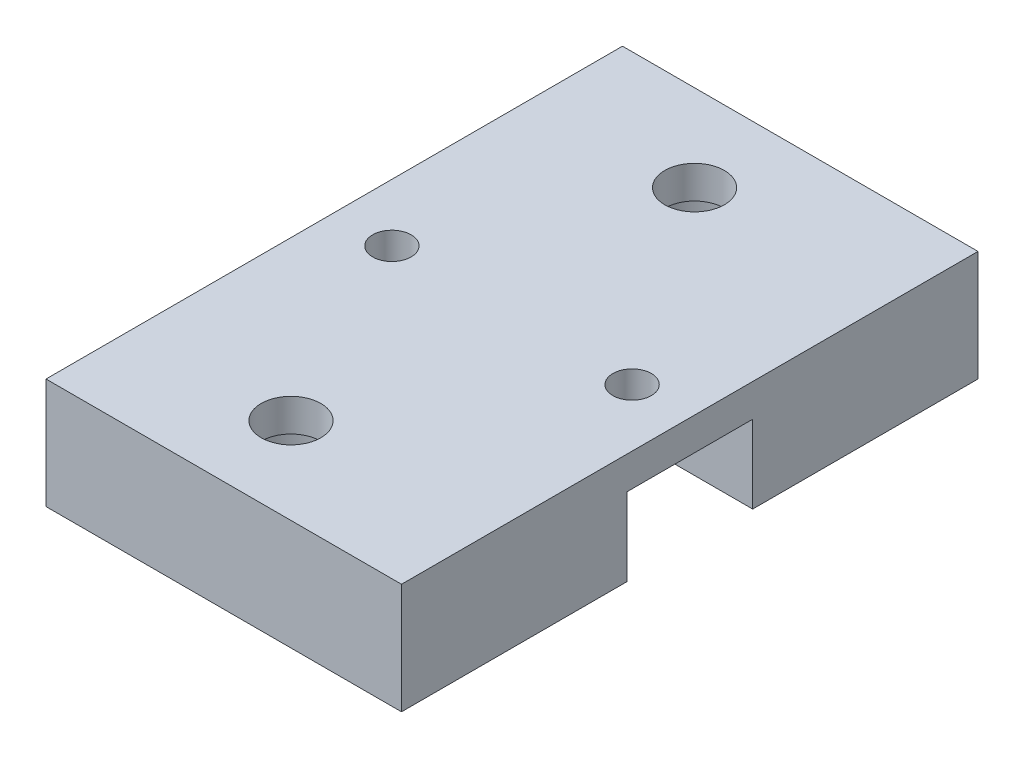
ISO-10303-21;
HEADER;
FILE_DESCRIPTION(('STEP AP214'),'2;1');
FILE_NAME('part.step','',(''),(''),'','','');
FILE_SCHEMA(('AUTOMOTIVE_DESIGN { 1 0 10303 214 1 1 1 1 }'));
ENDSEC;
DATA;
#1=APPLICATION_CONTEXT('core data for automotive mechanical design processes');
#2=APPLICATION_PROTOCOL_DEFINITION('international standard','automotive_design',2000,#1);
#3=PRODUCT_CONTEXT('',#1,'mechanical');
#4=PRODUCT('Part','Part','',(#3));
#5=PRODUCT_RELATED_PRODUCT_CATEGORY('part','',(#4));
#6=PRODUCT_DEFINITION_FORMATION('','',#4);
#7=PRODUCT_DEFINITION_CONTEXT('part definition',#1,'design');
#8=PRODUCT_DEFINITION('design','',#6,#7);
#9=PRODUCT_DEFINITION_SHAPE('','',#8);
#10=(LENGTH_UNIT() NAMED_UNIT(*) SI_UNIT(.MILLI.,.METRE.));
#11=(NAMED_UNIT(*) PLANE_ANGLE_UNIT() SI_UNIT($,.RADIAN.));
#12=(NAMED_UNIT(*) SI_UNIT($,.STERADIAN.) SOLID_ANGLE_UNIT());
#13=UNCERTAINTY_MEASURE_WITH_UNIT(LENGTH_MEASURE(1.E-05),#10,'distance_accuracy_value','');
#14=(GEOMETRIC_REPRESENTATION_CONTEXT(3) GLOBAL_UNCERTAINTY_ASSIGNED_CONTEXT((#13)) GLOBAL_UNIT_ASSIGNED_CONTEXT((#10,
#11,#12)) REPRESENTATION_CONTEXT('',''));
#15=CARTESIAN_POINT('',(0.,0.,0.));
#16=DIRECTION('',(0.,0.,1.));
#17=DIRECTION('',(1.,0.,0.));
#18=AXIS2_PLACEMENT_3D('',#15,#16,#17);
#19=CARTESIAN_POINT('',(0.,0.,0.));
#20=DIRECTION('',(0.,1.,0.));
#21=DIRECTION('',(0.,0.,1.));
#22=AXIS2_PLACEMENT_3D('',#19,#20,#21);
#23=PLANE('',#22);
#24=CARTESIAN_POINT('',(41.5,0.,-21.));
#25=DIRECTION('',(0.,1.,0.));
#26=DIRECTION('',(0.,0.,1.));
#27=AXIS2_PLACEMENT_3D('',#24,#25,#26);
#28=CIRCLE('',#27,3.09999999999999);
#29=CARTESIAN_POINT('',(41.5,0.,-17.9));
#30=VERTEX_POINT('',#29);
#31=EDGE_CURVE('E185',#30,#30,#28,.T.);
#32=ORIENTED_EDGE('',*,*,#31,.T.);
#33=EDGE_LOOP('',(#32));
#34=FACE_BOUND('',#33,.T.);
#35=CARTESIAN_POINT('',(41.5,0.,-21.));
#36=DIRECTION('',(0.,-1.,0.));
#37=DIRECTION('',(0.,0.,1.));
#38=AXIS2_PLACEMENT_3D('',#35,#36,#37);
#39=CIRCLE('',#38,5.5);
#40=CARTESIAN_POINT('',(41.5,0.,-15.5));
#41=VERTEX_POINT('',#40);
#42=EDGE_CURVE('E134',#41,#41,#39,.T.);
#43=ORIENTED_EDGE('',*,*,#42,.T.);
#44=EDGE_LOOP('',(#43));
#45=FACE_BOUND('',#44,.T.);
#46=ADVANCED_FACE('F41',(#34,#45),#23,.F.);
#47=CARTESIAN_POINT('',(41.5,0.,21.));
#48=DIRECTION('',(0.,1.,0.));
#49=DIRECTION('',(0.,0.,-1.));
#50=AXIS2_PLACEMENT_3D('',#47,#48,#49);
#51=CIRCLE('',#50,3.09999999999999);
#52=CARTESIAN_POINT('',(41.5,0.,17.9));
#53=VERTEX_POINT('',#52);
#54=EDGE_CURVE('E179',#53,#53,#51,.T.);
#55=ORIENTED_EDGE('',*,*,#54,.T.);
#56=EDGE_LOOP('',(#55));
#57=FACE_BOUND('',#56,.T.);
#58=CARTESIAN_POINT('',(41.5,0.,21.));
#59=DIRECTION('',(0.,-1.,0.));
#60=DIRECTION('',(0.,0.,-1.));
#61=AXIS2_PLACEMENT_3D('',#58,#59,#60);
#62=CIRCLE('',#61,5.5);
#63=CARTESIAN_POINT('',(41.5,0.,15.5));
#64=VERTEX_POINT('',#63);
#65=EDGE_CURVE('E143',#64,#64,#62,.T.);
#66=ORIENTED_EDGE('',*,*,#65,.T.);
#67=EDGE_LOOP('',(#66));
#68=FACE_BOUND('',#67,.T.);
#69=ADVANCED_FACE('F238',(#57,#68),#23,.F.);
#70=CARTESIAN_POINT('',(0.,3.4,0.));
#71=DIRECTION('',(0.,1.,0.));
#72=DIRECTION('',(0.,0.,1.));
#73=AXIS2_PLACEMENT_3D('',#70,#71,#72);
#74=PLANE('',#73);
#75=CARTESIAN_POINT('',(56.,3.4,0.));
#76=DIRECTION('',(0.,1.,0.));
#77=DIRECTION('',(0.,0.,1.));
#78=AXIS2_PLACEMENT_3D('',#75,#76,#77);
#79=CIRCLE('',#78,2.);
#80=CARTESIAN_POINT('',(56.,3.4,2.));
#81=VERTEX_POINT('',#80);
#82=EDGE_CURVE('E176',#81,#81,#79,.T.);
#83=ORIENTED_EDGE('',*,*,#82,.F.);
#84=EDGE_LOOP('',(#83));
#85=FACE_BOUND('',#84,.T.);
#86=CARTESIAN_POINT('',(41.5,3.4,-21.));
#87=DIRECTION('',(0.,1.,0.));
#88=DIRECTION('',(0.,0.,1.));
#89=AXIS2_PLACEMENT_3D('',#86,#87,#88);
#90=CIRCLE('',#89,3.09999999999999);
#91=CARTESIAN_POINT('',(41.5,3.4,-17.9));
#92=VERTEX_POINT('',#91);
#93=EDGE_CURVE('E188',#92,#92,#90,.T.);
#94=ORIENTED_EDGE('',*,*,#93,.F.);
#95=EDGE_LOOP('',(#94));
#96=FACE_BOUND('',#95,.T.);
#97=DIRECTION('',(0.,0.,1.));
#98=VECTOR('',#97,1.);
#99=CARTESIAN_POINT('',(25.,3.4,-30.));
#100=LINE('',#99,#98);
#101=CARTESIAN_POINT('',(25.,3.4,-30.));
#102=VERTEX_POINT('',#101);
#103=CARTESIAN_POINT('',(25.,3.4,30.));
#104=VERTEX_POINT('',#103);
#105=EDGE_CURVE('E112',#102,#104,#100,.T.);
#106=ORIENTED_EDGE('',*,*,#105,.T.);
#107=DIRECTION('',(1.,0.,0.));
#108=VECTOR('',#107,1.);
#109=CARTESIAN_POINT('',(25.,3.4,30.));
#110=LINE('',#109,#108);
#111=CARTESIAN_POINT('',(62.,3.4,30.));
#112=VERTEX_POINT('',#111);
#113=EDGE_CURVE('E194',#104,#112,#110,.T.);
#114=ORIENTED_EDGE('',*,*,#113,.T.);
#115=DIRECTION('',(0.,0.,-1.));
#116=VECTOR('',#115,1.);
#117=CARTESIAN_POINT('',(62.,3.4,-30.));
#118=LINE('',#117,#116);
#119=CARTESIAN_POINT('',(62.,3.4,-30.));
#120=VERTEX_POINT('',#119);
#121=EDGE_CURVE('E197',#112,#120,#118,.T.);
#122=ORIENTED_EDGE('',*,*,#121,.T.);
#123=DIRECTION('',(-1.,0.,0.));
#124=VECTOR('',#123,1.);
#125=CARTESIAN_POINT('',(25.,3.4,-30.));
#126=LINE('',#125,#124);
#127=EDGE_CURVE('E64',#120,#102,#126,.T.);
#128=ORIENTED_EDGE('',*,*,#127,.T.);
#129=EDGE_LOOP('',(#106,#114,#122,#128));
#130=FACE_BOUND('',#129,.T.);
#131=CARTESIAN_POINT('',(41.5,3.4,21.));
#132=DIRECTION('',(0.,1.,0.));
#133=DIRECTION('',(0.,0.,-1.));
#134=AXIS2_PLACEMENT_3D('',#131,#132,#133);
#135=CIRCLE('',#134,3.09999999999999);
#136=CARTESIAN_POINT('',(41.5,3.4,17.9));
#137=VERTEX_POINT('',#136);
#138=EDGE_CURVE('E182',#137,#137,#135,.T.);
#139=ORIENTED_EDGE('',*,*,#138,.F.);
#140=EDGE_LOOP('',(#139));
#141=FACE_BOUND('',#140,.T.);
#142=CARTESIAN_POINT('',(31.,3.4,1.74574066942157E-13));
#143=DIRECTION('',(0.,1.,0.));
#144=DIRECTION('',(0.,0.,1.));
#145=AXIS2_PLACEMENT_3D('',#142,#143,#144);
#146=CIRCLE('',#145,2.);
#147=CARTESIAN_POINT('',(31.,3.4,2.00000000000018));
#148=VERTEX_POINT('',#147);
#149=EDGE_CURVE('E170',#148,#148,#146,.T.);
#150=ORIENTED_EDGE('',*,*,#149,.F.);
#151=EDGE_LOOP('',(#150));
#152=FACE_BOUND('',#151,.T.);
#153=ADVANCED_FACE('F245',(#85,#96,#130,#141,#152),#74,.T.);
#154=DIRECTION('',(-1.,0.,0.));
#155=VECTOR('',#154,1.);
#156=CARTESIAN_POINT('',(25.,0.,-6.55));
#157=LINE('',#156,#155);
#158=CARTESIAN_POINT('',(62.,0.,-6.55));
#159=VERTEX_POINT('',#158);
#160=CARTESIAN_POINT('',(25.,0.,-6.55));
#161=VERTEX_POINT('',#160);
#162=EDGE_CURVE('E129',#159,#161,#157,.T.);
#163=ORIENTED_EDGE('',*,*,#162,.F.);
#164=DIRECTION('',(0.,0.,-1.));
#165=VECTOR('',#164,1.);
#166=CARTESIAN_POINT('',(62.,0.,-30.));
#167=LINE('',#166,#165);
#168=CARTESIAN_POINT('',(62.,0.,6.55));
#169=VERTEX_POINT('',#168);
#170=EDGE_CURVE('E195',#169,#159,#167,.T.);
#171=ORIENTED_EDGE('',*,*,#170,.F.);
#172=DIRECTION('',(1.,0.,0.));
#173=VECTOR('',#172,1.);
#174=CARTESIAN_POINT('',(25.,0.,6.55));
#175=LINE('',#174,#173);
#176=CARTESIAN_POINT('',(25.,0.,6.55));
#177=VERTEX_POINT('',#176);
#178=EDGE_CURVE('E147',#177,#169,#175,.T.);
#179=ORIENTED_EDGE('',*,*,#178,.F.);
#180=DIRECTION('',(0.,0.,1.));
#181=VECTOR('',#180,1.);
#182=CARTESIAN_POINT('',(25.,0.,-30.));
#183=LINE('',#182,#181);
#184=EDGE_CURVE('E56',#161,#177,#183,.T.);
#185=ORIENTED_EDGE('',*,*,#184,.F.);
#186=EDGE_LOOP('',(#163,#171,#179,#185));
#187=FACE_BOUND('',#186,.T.);
#188=CARTESIAN_POINT('',(56.,0.,0.));
#189=DIRECTION('',(0.,1.,0.));
#190=DIRECTION('',(0.,0.,1.));
#191=AXIS2_PLACEMENT_3D('',#188,#189,#190);
#192=CIRCLE('',#191,2.);
#193=CARTESIAN_POINT('',(56.,0.,2.));
#194=VERTEX_POINT('',#193);
#195=EDGE_CURVE('E173',#194,#194,#192,.T.);
#196=ORIENTED_EDGE('',*,*,#195,.T.);
#197=EDGE_LOOP('',(#196));
#198=FACE_BOUND('',#197,.T.);
#199=CARTESIAN_POINT('',(31.,0.,1.74574066942157E-13));
#200=DIRECTION('',(0.,1.,0.));
#201=DIRECTION('',(0.,0.,1.));
#202=AXIS2_PLACEMENT_3D('',#199,#200,#201);
#203=CIRCLE('',#202,2.);
#204=CARTESIAN_POINT('',(31.,0.,2.00000000000018));
#205=VERTEX_POINT('',#204);
#206=EDGE_CURVE('E169',#205,#205,#203,.T.);
#207=ORIENTED_EDGE('',*,*,#206,.T.);
#208=EDGE_LOOP('',(#207));
#209=FACE_BOUND('',#208,.T.);
#210=ADVANCED_FACE('F221',(#187,#198,#209),#23,.F.);
#211=CARTESIAN_POINT('',(25.,3.4,-30.));
#212=DIRECTION('',(1.,0.,0.));
#213=DIRECTION('',(0.,0.,-1.));
#214=AXIS2_PLACEMENT_3D('',#211,#212,#213);
#215=PLANE('',#214);
#216=DIRECTION('',(0.,-1.,0.));
#217=VECTOR('',#216,1.);
#218=CARTESIAN_POINT('',(25.,3.4,-30.));
#219=LINE('',#218,#217);
#220=CARTESIAN_POINT('',(25.,-8.1,-30.));
#221=VERTEX_POINT('',#220);
#222=EDGE_CURVE('E107',#102,#221,#219,.T.);
#223=ORIENTED_EDGE('',*,*,#222,.T.);
#224=DIRECTION('',(0.,0.,-1.));
#225=VECTOR('',#224,1.);
#226=CARTESIAN_POINT('',(25.,-8.1,-30.));
#227=LINE('',#226,#225);
#228=CARTESIAN_POINT('',(25.,-8.1,-6.55));
#229=VERTEX_POINT('',#228);
#230=EDGE_CURVE('E110',#229,#221,#227,.T.);
#231=ORIENTED_EDGE('',*,*,#230,.F.);
#232=DIRECTION('',(0.,1.,0.));
#233=VECTOR('',#232,1.);
#234=CARTESIAN_POINT('',(25.,-8.1,-6.55));
#235=LINE('',#234,#233);
#236=EDGE_CURVE('E138',#229,#161,#235,.T.);
#237=ORIENTED_EDGE('',*,*,#236,.T.);
#238=ORIENTED_EDGE('',*,*,#184,.T.);
#239=DIRECTION('',(0.,1.,0.));
#240=VECTOR('',#239,1.);
#241=CARTESIAN_POINT('',(25.,-8.1,6.55));
#242=LINE('',#241,#240);
#243=CARTESIAN_POINT('',(25.,-8.1,6.55));
#244=VERTEX_POINT('',#243);
#245=EDGE_CURVE('E166',#244,#177,#242,.T.);
#246=ORIENTED_EDGE('',*,*,#245,.F.);
#247=DIRECTION('',(0.,0.,-1.));
#248=VECTOR('',#247,1.);
#249=CARTESIAN_POINT('',(25.,-8.1,30.));
#250=LINE('',#249,#248);
#251=CARTESIAN_POINT('',(25.,-8.1,30.));
#252=VERTEX_POINT('',#251);
#253=EDGE_CURVE('E150',#252,#244,#250,.T.);
#254=ORIENTED_EDGE('',*,*,#253,.F.);
#255=DIRECTION('',(0.,-1.,0.));
#256=VECTOR('',#255,1.);
#257=CARTESIAN_POINT('',(25.,3.4,30.));
#258=LINE('',#257,#256);
#259=EDGE_CURVE('E11',#104,#252,#258,.T.);
#260=ORIENTED_EDGE('',*,*,#259,.F.);
#261=ORIENTED_EDGE('',*,*,#105,.F.);
#262=EDGE_LOOP('',(#223,#231,#237,#238,#246,#254,#260,#261));
#263=FACE_BOUND('',#262,.T.);
#264=ADVANCED_FACE('F43',(#263),#215,.F.);
#265=CARTESIAN_POINT('',(25.,3.4,30.));
#266=DIRECTION('',(0.,0.,-1.));
#267=DIRECTION('',(-1.,0.,0.));
#268=AXIS2_PLACEMENT_3D('',#265,#266,#267);
#269=PLANE('',#268);
#270=ORIENTED_EDGE('',*,*,#259,.T.);
#271=DIRECTION('',(-1.,0.,0.));
#272=VECTOR('',#271,1.);
#273=CARTESIAN_POINT('',(25.,-8.1,30.));
#274=LINE('',#273,#272);
#275=CARTESIAN_POINT('',(62.,-8.1,30.));
#276=VERTEX_POINT('',#275);
#277=EDGE_CURVE('E158',#276,#252,#274,.T.);
#278=ORIENTED_EDGE('',*,*,#277,.F.);
#279=DIRECTION('',(0.,-1.,0.));
#280=VECTOR('',#279,1.);
#281=CARTESIAN_POINT('',(62.,3.4,30.));
#282=LINE('',#281,#280);
#283=EDGE_CURVE('E49',#112,#276,#282,.T.);
#284=ORIENTED_EDGE('',*,*,#283,.F.);
#285=ORIENTED_EDGE('',*,*,#113,.F.);
#286=EDGE_LOOP('',(#270,#278,#284,#285));
#287=FACE_BOUND('',#286,.T.);
#288=ADVANCED_FACE('F215',(#287),#269,.F.);
#289=CARTESIAN_POINT('',(62.,3.4,-30.));
#290=DIRECTION('',(-1.,0.,0.));
#291=DIRECTION('',(0.,0.,1.));
#292=AXIS2_PLACEMENT_3D('',#289,#290,#291);
#293=PLANE('',#292);
#294=ORIENTED_EDGE('',*,*,#283,.T.);
#295=DIRECTION('',(0.,0.,1.));
#296=VECTOR('',#295,1.);
#297=CARTESIAN_POINT('',(62.,-8.1,30.));
#298=LINE('',#297,#296);
#299=CARTESIAN_POINT('',(62.,-8.1,6.55));
#300=VERTEX_POINT('',#299);
#301=EDGE_CURVE('E155',#300,#276,#298,.T.);
#302=ORIENTED_EDGE('',*,*,#301,.F.);
#303=DIRECTION('',(0.,1.,0.));
#304=VECTOR('',#303,1.);
#305=CARTESIAN_POINT('',(62.,-8.1,6.55));
#306=LINE('',#305,#304);
#307=EDGE_CURVE('E161',#300,#169,#306,.T.);
#308=ORIENTED_EDGE('',*,*,#307,.T.);
#309=ORIENTED_EDGE('',*,*,#170,.T.);
#310=DIRECTION('',(0.,1.,0.));
#311=VECTOR('',#310,1.);
#312=CARTESIAN_POINT('',(62.,-8.1,-6.55));
#313=LINE('',#312,#311);
#314=CARTESIAN_POINT('',(62.,-8.1,-6.55));
#315=VERTEX_POINT('',#314);
#316=EDGE_CURVE('E141',#315,#159,#313,.T.);
#317=ORIENTED_EDGE('',*,*,#316,.F.);
#318=DIRECTION('',(0.,0.,1.));
#319=VECTOR('',#318,1.);
#320=CARTESIAN_POINT('',(62.,-8.1,-30.));
#321=LINE('',#320,#319);
#322=CARTESIAN_POINT('',(62.,-8.1,-30.));
#323=VERTEX_POINT('',#322);
#324=EDGE_CURVE('E122',#323,#315,#321,.T.);
#325=ORIENTED_EDGE('',*,*,#324,.F.);
#326=DIRECTION('',(0.,-1.,0.));
#327=VECTOR('',#326,1.);
#328=CARTESIAN_POINT('',(62.,3.4,-30.));
#329=LINE('',#328,#327);
#330=EDGE_CURVE('E114',#120,#323,#329,.T.);
#331=ORIENTED_EDGE('',*,*,#330,.F.);
#332=ORIENTED_EDGE('',*,*,#121,.F.);
#333=EDGE_LOOP('',(#294,#302,#308,#309,#317,#325,#331,#332));
#334=FACE_BOUND('',#333,.T.);
#335=ADVANCED_FACE('F207',(#334),#293,.F.);
#336=CARTESIAN_POINT('',(25.,3.4,-30.));
#337=DIRECTION('',(0.,0.,1.));
#338=DIRECTION('',(1.,0.,0.));
#339=AXIS2_PLACEMENT_3D('',#336,#337,#338);
#340=PLANE('',#339);
#341=ORIENTED_EDGE('',*,*,#330,.T.);
#342=DIRECTION('',(1.,0.,0.));
#343=VECTOR('',#342,1.);
#344=CARTESIAN_POINT('',(25.,-8.1,-30.));
#345=LINE('',#344,#343);
#346=EDGE_CURVE('E117',#221,#323,#345,.T.);
#347=ORIENTED_EDGE('',*,*,#346,.F.);
#348=ORIENTED_EDGE('',*,*,#222,.F.);
#349=ORIENTED_EDGE('',*,*,#127,.F.);
#350=EDGE_LOOP('',(#341,#347,#348,#349));
#351=FACE_BOUND('',#350,.T.);
#352=ADVANCED_FACE('F118',(#351),#340,.F.);
#353=CARTESIAN_POINT('',(41.5,3.4,-21.));
#354=DIRECTION('',(0.,-1.,0.));
#355=DIRECTION('',(0.,0.,-1.));
#356=AXIS2_PLACEMENT_3D('',#353,#354,#355);
#357=CYLINDRICAL_SURFACE('',#356,3.09999999999999);
#358=ORIENTED_EDGE('',*,*,#93,.T.);
#359=EDGE_LOOP('',(#358));
#360=FACE_BOUND('',#359,.T.);
#361=ORIENTED_EDGE('',*,*,#31,.F.);
#362=EDGE_LOOP('',(#361));
#363=FACE_BOUND('',#362,.T.);
#364=ADVANCED_FACE('F262',(#360,#363),#357,.F.);
#365=CARTESIAN_POINT('',(41.5,3.4,21.));
#366=DIRECTION('',(0.,-1.,0.));
#367=DIRECTION('',(0.,0.,-1.));
#368=AXIS2_PLACEMENT_3D('',#365,#366,#367);
#369=CYLINDRICAL_SURFACE('',#368,3.09999999999999);
#370=ORIENTED_EDGE('',*,*,#138,.T.);
#371=EDGE_LOOP('',(#370));
#372=FACE_BOUND('',#371,.T.);
#373=ORIENTED_EDGE('',*,*,#54,.F.);
#374=EDGE_LOOP('',(#373));
#375=FACE_BOUND('',#374,.T.);
#376=ADVANCED_FACE('F264',(#372,#375),#369,.F.);
#377=CARTESIAN_POINT('',(56.,3.4,0.));
#378=DIRECTION('',(0.,-1.,0.));
#379=DIRECTION('',(0.,0.,-1.));
#380=AXIS2_PLACEMENT_3D('',#377,#378,#379);
#381=CYLINDRICAL_SURFACE('',#380,2.);
#382=ORIENTED_EDGE('',*,*,#82,.T.);
#383=EDGE_LOOP('',(#382));
#384=FACE_BOUND('',#383,.T.);
#385=ORIENTED_EDGE('',*,*,#195,.F.);
#386=EDGE_LOOP('',(#385));
#387=FACE_BOUND('',#386,.T.);
#388=ADVANCED_FACE('F268',(#384,#387),#381,.F.);
#389=CARTESIAN_POINT('',(31.,3.4,1.74574066942157E-13));
#390=DIRECTION('',(0.,-1.,0.));
#391=DIRECTION('',(0.,0.,-1.));
#392=AXIS2_PLACEMENT_3D('',#389,#390,#391);
#393=CYLINDRICAL_SURFACE('',#392,2.);
#394=ORIENTED_EDGE('',*,*,#149,.T.);
#395=EDGE_LOOP('',(#394));
#396=FACE_BOUND('',#395,.T.);
#397=ORIENTED_EDGE('',*,*,#206,.F.);
#398=EDGE_LOOP('',(#397));
#399=FACE_BOUND('',#398,.T.);
#400=ADVANCED_FACE('F272',(#396,#399),#393,.F.);
#401=CARTESIAN_POINT('',(0.,-8.1,0.));
#402=DIRECTION('',(0.,-1.,0.));
#403=DIRECTION('',(0.,0.,-1.));
#404=AXIS2_PLACEMENT_3D('',#401,#402,#403);
#405=PLANE('',#404);
#406=ORIENTED_EDGE('',*,*,#253,.T.);
#407=DIRECTION('',(1.,0.,0.));
#408=VECTOR('',#407,1.);
#409=CARTESIAN_POINT('',(25.,-8.1,6.55));
#410=LINE('',#409,#408);
#411=EDGE_CURVE('E153',#244,#300,#410,.T.);
#412=ORIENTED_EDGE('',*,*,#411,.T.);
#413=ORIENTED_EDGE('',*,*,#301,.T.);
#414=ORIENTED_EDGE('',*,*,#277,.T.);
#415=EDGE_LOOP('',(#406,#412,#413,#414));
#416=FACE_BOUND('',#415,.T.);
#417=CARTESIAN_POINT('',(41.5,-8.1,21.));
#418=DIRECTION('',(0.,-1.,0.));
#419=DIRECTION('',(0.,0.,-1.));
#420=AXIS2_PLACEMENT_3D('',#417,#418,#419);
#421=CIRCLE('',#420,5.5);
#422=CARTESIAN_POINT('',(41.5,-8.1,15.5));
#423=VERTEX_POINT('',#422);
#424=EDGE_CURVE('E144',#423,#423,#421,.T.);
#425=ORIENTED_EDGE('',*,*,#424,.F.);
#426=EDGE_LOOP('',(#425));
#427=FACE_BOUND('',#426,.T.);
#428=ADVANCED_FACE('F211',(#416,#427),#405,.T.);
#429=CARTESIAN_POINT('',(25.,-8.1,6.55));
#430=DIRECTION('',(0.,0.,1.));
#431=DIRECTION('',(1.,0.,0.));
#432=AXIS2_PLACEMENT_3D('',#429,#430,#431);
#433=PLANE('',#432);
#434=ORIENTED_EDGE('',*,*,#178,.T.);
#435=ORIENTED_EDGE('',*,*,#307,.F.);
#436=ORIENTED_EDGE('',*,*,#411,.F.);
#437=ORIENTED_EDGE('',*,*,#245,.T.);
#438=EDGE_LOOP('',(#434,#435,#436,#437));
#439=FACE_BOUND('',#438,.T.);
#440=ADVANCED_FACE('F217',(#439),#433,.F.);
#441=CARTESIAN_POINT('',(41.5,-8.1,21.));
#442=DIRECTION('',(0.,1.,0.));
#443=DIRECTION('',(0.,0.,1.));
#444=AXIS2_PLACEMENT_3D('',#441,#442,#443);
#445=CYLINDRICAL_SURFACE('',#444,5.5);
#446=ORIENTED_EDGE('',*,*,#424,.T.);
#447=EDGE_LOOP('',(#446));
#448=FACE_BOUND('',#447,.T.);
#449=ORIENTED_EDGE('',*,*,#65,.F.);
#450=EDGE_LOOP('',(#449));
#451=FACE_BOUND('',#450,.T.);
#452=ADVANCED_FACE('F234',(#448,#451),#445,.F.);
#453=CARTESIAN_POINT('',(0.,-8.1,0.));
#454=DIRECTION('',(0.,1.,0.));
#455=DIRECTION('',(0.,0.,1.));
#456=AXIS2_PLACEMENT_3D('',#453,#454,#455);
#457=PLANE('',#456);
#458=ORIENTED_EDGE('',*,*,#230,.T.);
#459=ORIENTED_EDGE('',*,*,#346,.T.);
#460=ORIENTED_EDGE('',*,*,#324,.T.);
#461=DIRECTION('',(-1.,0.,0.));
#462=VECTOR('',#461,1.);
#463=CARTESIAN_POINT('',(25.,-8.1,-6.55));
#464=LINE('',#463,#462);
#465=EDGE_CURVE('E127',#315,#229,#464,.T.);
#466=ORIENTED_EDGE('',*,*,#465,.T.);
#467=EDGE_LOOP('',(#458,#459,#460,#466));
#468=FACE_BOUND('',#467,.T.);
#469=CARTESIAN_POINT('',(41.5,-8.1,-21.));
#470=DIRECTION('',(0.,-1.,0.));
#471=DIRECTION('',(0.,0.,1.));
#472=AXIS2_PLACEMENT_3D('',#469,#470,#471);
#473=CIRCLE('',#472,5.5);
#474=CARTESIAN_POINT('',(41.5,-8.1,-15.5));
#475=VERTEX_POINT('',#474);
#476=EDGE_CURVE('E131',#475,#475,#473,.T.);
#477=ORIENTED_EDGE('',*,*,#476,.F.);
#478=EDGE_LOOP('',(#477));
#479=FACE_BOUND('',#478,.T.);
#480=ADVANCED_FACE('F124',(#468,#479),#457,.F.);
#481=CARTESIAN_POINT('',(25.,-8.1,-6.55));
#482=DIRECTION('',(0.,0.,-1.));
#483=DIRECTION('',(-1.,0.,0.));
#484=AXIS2_PLACEMENT_3D('',#481,#482,#483);
#485=PLANE('',#484);
#486=ORIENTED_EDGE('',*,*,#162,.T.);
#487=ORIENTED_EDGE('',*,*,#236,.F.);
#488=ORIENTED_EDGE('',*,*,#465,.F.);
#489=ORIENTED_EDGE('',*,*,#316,.T.);
#490=EDGE_LOOP('',(#486,#487,#488,#489));
#491=FACE_BOUND('',#490,.T.);
#492=ADVANCED_FACE('F224',(#491),#485,.F.);
#493=CARTESIAN_POINT('',(41.5,-8.1,-21.));
#494=DIRECTION('',(0.,1.,0.));
#495=DIRECTION('',(0.,0.,1.));
#496=AXIS2_PLACEMENT_3D('',#493,#494,#495);
#497=CYLINDRICAL_SURFACE('',#496,5.5);
#498=ORIENTED_EDGE('',*,*,#476,.T.);
#499=EDGE_LOOP('',(#498));
#500=FACE_BOUND('',#499,.T.);
#501=ORIENTED_EDGE('',*,*,#42,.F.);
#502=EDGE_LOOP('',(#501));
#503=FACE_BOUND('',#502,.T.);
#504=ADVANCED_FACE('F226',(#500,#503),#497,.F.);
#505=CLOSED_SHELL('',(#46,#69,#153,#210,#264,#288,#335,#352,#364,#376,#388,#400,#428,#440,#452,
#480,#492,#504));
#506=MANIFOLD_SOLID_BREP('B2',#505);
#507=ADVANCED_BREP_SHAPE_REPRESENTATION('',(#18,#506),#14);
#508=SHAPE_DEFINITION_REPRESENTATION(#9,#507);
ENDSEC;
END-ISO-10303-21;
